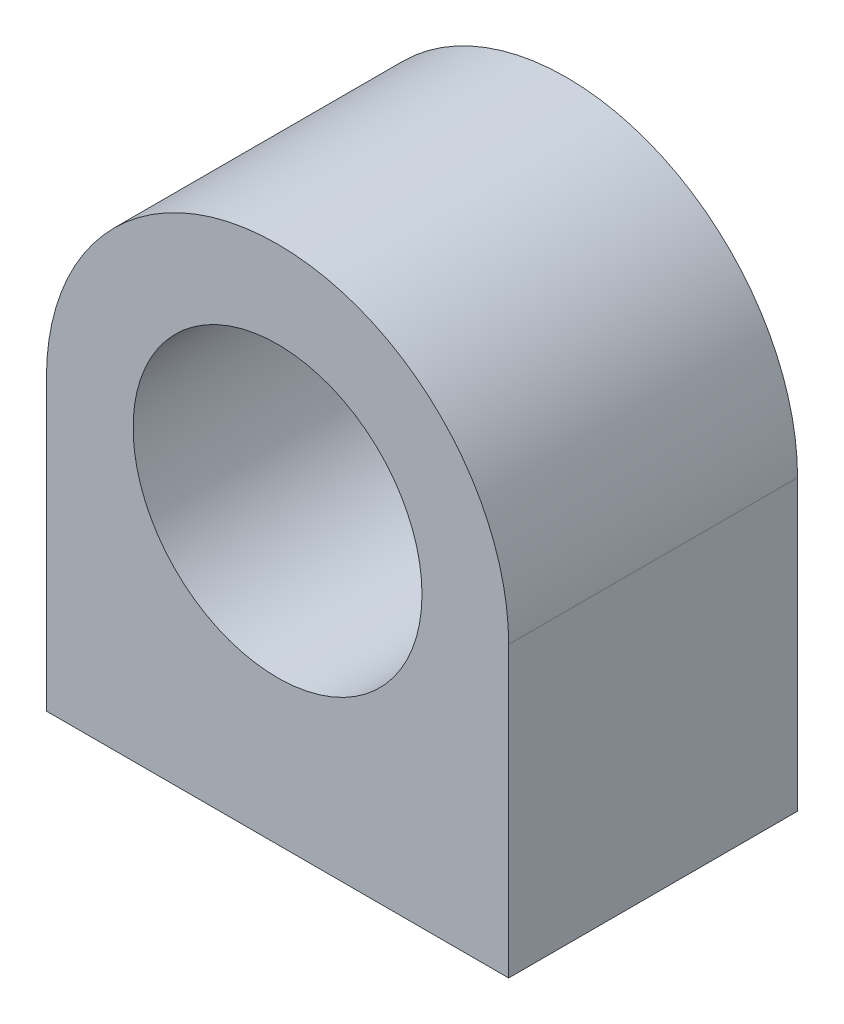
ISO-10303-21;
HEADER;
FILE_DESCRIPTION(('STEP AP214'),'2;1');
FILE_NAME('part.step','',(''),(''),'','','');
FILE_SCHEMA(('AUTOMOTIVE_DESIGN { 1 0 10303 214 1 1 1 1 }'));
ENDSEC;
DATA;
#1=APPLICATION_CONTEXT('core data for automotive mechanical design processes');
#2=APPLICATION_PROTOCOL_DEFINITION('international standard','automotive_design',2000,#1);
#3=PRODUCT_CONTEXT('',#1,'mechanical');
#4=PRODUCT('Part','Part','',(#3));
#5=PRODUCT_RELATED_PRODUCT_CATEGORY('part','',(#4));
#6=PRODUCT_DEFINITION_FORMATION('','',#4);
#7=PRODUCT_DEFINITION_CONTEXT('part definition',#1,'design');
#8=PRODUCT_DEFINITION('design','',#6,#7);
#9=PRODUCT_DEFINITION_SHAPE('','',#8);
#10=(LENGTH_UNIT() NAMED_UNIT(*) SI_UNIT(.MILLI.,.METRE.));
#11=(NAMED_UNIT(*) PLANE_ANGLE_UNIT() SI_UNIT($,.RADIAN.));
#12=(NAMED_UNIT(*) SI_UNIT($,.STERADIAN.) SOLID_ANGLE_UNIT());
#13=UNCERTAINTY_MEASURE_WITH_UNIT(LENGTH_MEASURE(1.E-05),#10,'distance_accuracy_value','');
#14=(GEOMETRIC_REPRESENTATION_CONTEXT(3) GLOBAL_UNCERTAINTY_ASSIGNED_CONTEXT((#13)) GLOBAL_UNIT_ASSIGNED_CONTEXT((#10,
#11,#12)) REPRESENTATION_CONTEXT('',''));
#15=CARTESIAN_POINT('',(0.,0.,0.));
#16=DIRECTION('',(0.,0.,1.));
#17=DIRECTION('',(1.,0.,0.));
#18=AXIS2_PLACEMENT_3D('',#15,#16,#17);
#19=CARTESIAN_POINT('',(0.,5.,2.5));
#20=DIRECTION('',(0.,0.,1.));
#21=DIRECTION('',(1.,0.,0.));
#22=AXIS2_PLACEMENT_3D('',#19,#20,#21);
#23=PLANE('',#22);
#24=DIRECTION('',(0.,-1.,0.));
#25=VECTOR('',#24,1.);
#26=CARTESIAN_POINT('',(-4.,5.,2.5));
#27=LINE('',#26,#25);
#28=CARTESIAN_POINT('',(-4.,5.,2.5));
#29=VERTEX_POINT('',#28);
#30=CARTESIAN_POINT('',(-4.,0.,2.5));
#31=VERTEX_POINT('',#30);
#32=EDGE_CURVE('E89',#29,#31,#27,.T.);
#33=ORIENTED_EDGE('',*,*,#32,.T.);
#34=DIRECTION('',(1.,0.,0.));
#35=VECTOR('',#34,1.);
#36=CARTESIAN_POINT('',(-4.,0.,2.5));
#37=LINE('',#36,#35);
#38=CARTESIAN_POINT('',(4.,0.,2.5));
#39=VERTEX_POINT('',#38);
#40=EDGE_CURVE('E84',#31,#39,#37,.T.);
#41=ORIENTED_EDGE('',*,*,#40,.T.);
#42=DIRECTION('',(0.,1.,0.));
#43=VECTOR('',#42,1.);
#44=CARTESIAN_POINT('',(4.,0.,2.5));
#45=LINE('',#44,#43);
#46=CARTESIAN_POINT('',(4.,5.,2.5));
#47=VERTEX_POINT('',#46);
#48=EDGE_CURVE('E87',#39,#47,#45,.T.);
#49=ORIENTED_EDGE('',*,*,#48,.T.);
#50=CARTESIAN_POINT('',(0.,5.,2.5));
#51=DIRECTION('',(0.,0.,1.));
#52=DIRECTION('',(1.,0.,0.));
#53=AXIS2_PLACEMENT_3D('',#50,#51,#52);
#54=CIRCLE('',#53,4.);
#55=EDGE_CURVE('E54',#47,#29,#54,.T.);
#56=ORIENTED_EDGE('',*,*,#55,.T.);
#57=EDGE_LOOP('',(#33,#41,#49,#56));
#58=FACE_BOUND('',#57,.T.);
#59=CARTESIAN_POINT('',(0.,5.,2.5));
#60=DIRECTION('',(0.,0.,1.));
#61=DIRECTION('',(1.,0.,0.));
#62=AXIS2_PLACEMENT_3D('',#59,#60,#61);
#63=CIRCLE('',#62,2.5);
#64=CARTESIAN_POINT('',(2.5,5.,2.5));
#65=VERTEX_POINT('',#64);
#66=EDGE_CURVE('E104',#65,#65,#63,.T.);
#67=ORIENTED_EDGE('',*,*,#66,.F.);
#68=EDGE_LOOP('',(#67));
#69=FACE_BOUND('',#68,.T.);
#70=ADVANCED_FACE('F37',(#58,#69),#23,.T.);
#71=CARTESIAN_POINT('',(0.,5.,-2.5));
#72=DIRECTION('',(0.,0.,1.));
#73=DIRECTION('',(1.,0.,0.));
#74=AXIS2_PLACEMENT_3D('',#71,#72,#73);
#75=PLANE('',#74);
#76=DIRECTION('',(0.,-1.,0.));
#77=VECTOR('',#76,1.);
#78=CARTESIAN_POINT('',(-4.,5.,-2.5));
#79=LINE('',#78,#77);
#80=CARTESIAN_POINT('',(-4.,5.,-2.5));
#81=VERTEX_POINT('',#80);
#82=CARTESIAN_POINT('',(-4.,0.,-2.5));
#83=VERTEX_POINT('',#82);
#84=EDGE_CURVE('E101',#81,#83,#79,.T.);
#85=ORIENTED_EDGE('',*,*,#84,.F.);
#86=CARTESIAN_POINT('',(0.,5.,-2.5));
#87=DIRECTION('',(0.,0.,1.));
#88=DIRECTION('',(1.,0.,0.));
#89=AXIS2_PLACEMENT_3D('',#86,#87,#88);
#90=CIRCLE('',#89,4.);
#91=CARTESIAN_POINT('',(4.,5.,-2.5));
#92=VERTEX_POINT('',#91);
#93=EDGE_CURVE('E77',#92,#81,#90,.T.);
#94=ORIENTED_EDGE('',*,*,#93,.F.);
#95=DIRECTION('',(0.,1.,0.));
#96=VECTOR('',#95,1.);
#97=CARTESIAN_POINT('',(4.,0.,-2.5));
#98=LINE('',#97,#96);
#99=CARTESIAN_POINT('',(4.,0.,-2.5));
#100=VERTEX_POINT('',#99);
#101=EDGE_CURVE('E71',#100,#92,#98,.T.);
#102=ORIENTED_EDGE('',*,*,#101,.F.);
#103=DIRECTION('',(1.,0.,0.));
#104=VECTOR('',#103,1.);
#105=CARTESIAN_POINT('',(-4.,0.,-2.5));
#106=LINE('',#105,#104);
#107=EDGE_CURVE('E93',#83,#100,#106,.T.);
#108=ORIENTED_EDGE('',*,*,#107,.F.);
#109=EDGE_LOOP('',(#85,#94,#102,#108));
#110=FACE_BOUND('',#109,.T.);
#111=CARTESIAN_POINT('',(0.,5.,-2.5));
#112=DIRECTION('',(0.,0.,1.));
#113=DIRECTION('',(1.,0.,0.));
#114=AXIS2_PLACEMENT_3D('',#111,#112,#113);
#115=CIRCLE('',#114,2.5);
#116=CARTESIAN_POINT('',(2.5,5.,-2.5));
#117=VERTEX_POINT('',#116);
#118=EDGE_CURVE('E116',#117,#117,#115,.T.);
#119=ORIENTED_EDGE('',*,*,#118,.T.);
#120=EDGE_LOOP('',(#119));
#121=FACE_BOUND('',#120,.T.);
#122=ADVANCED_FACE('F112',(#110,#121),#75,.F.);
#123=CARTESIAN_POINT('',(-4.,5.,2.5));
#124=DIRECTION('',(1.,0.,0.));
#125=DIRECTION('',(0.,0.,-1.));
#126=AXIS2_PLACEMENT_3D('',#123,#124,#125);
#127=PLANE('',#126);
#128=ORIENTED_EDGE('',*,*,#84,.T.);
#129=DIRECTION('',(0.,0.,-1.));
#130=VECTOR('',#129,1.);
#131=CARTESIAN_POINT('',(-4.,0.,2.5));
#132=LINE('',#131,#130);
#133=EDGE_CURVE('E11',#31,#83,#132,.T.);
#134=ORIENTED_EDGE('',*,*,#133,.F.);
#135=ORIENTED_EDGE('',*,*,#32,.F.);
#136=DIRECTION('',(0.,0.,-1.));
#137=VECTOR('',#136,1.);
#138=CARTESIAN_POINT('',(-4.,5.,2.5));
#139=LINE('',#138,#137);
#140=EDGE_CURVE('E97',#29,#81,#139,.T.);
#141=ORIENTED_EDGE('',*,*,#140,.T.);
#142=EDGE_LOOP('',(#128,#134,#135,#141));
#143=FACE_BOUND('',#142,.T.);
#144=ADVANCED_FACE('F39',(#143),#127,.F.);
#145=CARTESIAN_POINT('',(-4.,0.,2.5));
#146=DIRECTION('',(0.,1.,0.));
#147=DIRECTION('',(-1.,0.,0.));
#148=AXIS2_PLACEMENT_3D('',#145,#146,#147);
#149=PLANE('',#148);
#150=ORIENTED_EDGE('',*,*,#107,.T.);
#151=DIRECTION('',(0.,0.,-1.));
#152=VECTOR('',#151,1.);
#153=CARTESIAN_POINT('',(4.,0.,2.5));
#154=LINE('',#153,#152);
#155=EDGE_CURVE('E46',#39,#100,#154,.T.);
#156=ORIENTED_EDGE('',*,*,#155,.F.);
#157=ORIENTED_EDGE('',*,*,#40,.F.);
#158=ORIENTED_EDGE('',*,*,#133,.T.);
#159=EDGE_LOOP('',(#150,#156,#157,#158));
#160=FACE_BOUND('',#159,.T.);
#161=ADVANCED_FACE('F92',(#160),#149,.F.);
#162=CARTESIAN_POINT('',(4.,0.,2.5));
#163=DIRECTION('',(-1.,0.,0.));
#164=DIRECTION('',(0.,-1.,0.));
#165=AXIS2_PLACEMENT_3D('',#162,#163,#164);
#166=PLANE('',#165);
#167=ORIENTED_EDGE('',*,*,#101,.T.);
#168=DIRECTION('',(0.,0.,-1.));
#169=VECTOR('',#168,1.);
#170=CARTESIAN_POINT('',(4.,5.,2.5));
#171=LINE('',#170,#169);
#172=EDGE_CURVE('E94',#47,#92,#171,.T.);
#173=ORIENTED_EDGE('',*,*,#172,.F.);
#174=ORIENTED_EDGE('',*,*,#48,.F.);
#175=ORIENTED_EDGE('',*,*,#155,.T.);
#176=EDGE_LOOP('',(#167,#173,#174,#175));
#177=FACE_BOUND('',#176,.T.);
#178=ADVANCED_FACE('F95',(#177),#166,.F.);
#179=CARTESIAN_POINT('',(0.,5.,2.5));
#180=DIRECTION('',(0.,0.,-1.));
#181=DIRECTION('',(-1.,0.,0.));
#182=AXIS2_PLACEMENT_3D('',#179,#180,#181);
#183=CYLINDRICAL_SURFACE('',#182,4.);
#184=ORIENTED_EDGE('',*,*,#93,.T.);
#185=ORIENTED_EDGE('',*,*,#140,.F.);
#186=ORIENTED_EDGE('',*,*,#55,.F.);
#187=ORIENTED_EDGE('',*,*,#172,.T.);
#188=EDGE_LOOP('',(#184,#185,#186,#187));
#189=FACE_BOUND('',#188,.T.);
#190=ADVANCED_FACE('F109',(#189),#183,.T.);
#191=CARTESIAN_POINT('',(0.,5.,2.5));
#192=DIRECTION('',(0.,0.,-1.));
#193=DIRECTION('',(-1.,0.,0.));
#194=AXIS2_PLACEMENT_3D('',#191,#192,#193);
#195=CYLINDRICAL_SURFACE('',#194,2.5);
#196=ORIENTED_EDGE('',*,*,#66,.T.);
#197=EDGE_LOOP('',(#196));
#198=FACE_BOUND('',#197,.T.);
#199=ORIENTED_EDGE('',*,*,#118,.F.);
#200=EDGE_LOOP('',(#199));
#201=FACE_BOUND('',#200,.T.);
#202=ADVANCED_FACE('F122',(#198,#201),#195,.F.);
#203=CLOSED_SHELL('',(#70,#122,#144,#161,#178,#190,#202));
#204=MANIFOLD_SOLID_BREP('B2',#203);
#205=ADVANCED_BREP_SHAPE_REPRESENTATION('',(#18,#204),#14);
#206=SHAPE_DEFINITION_REPRESENTATION(#9,#205);
ENDSEC;
END-ISO-10303-21;
